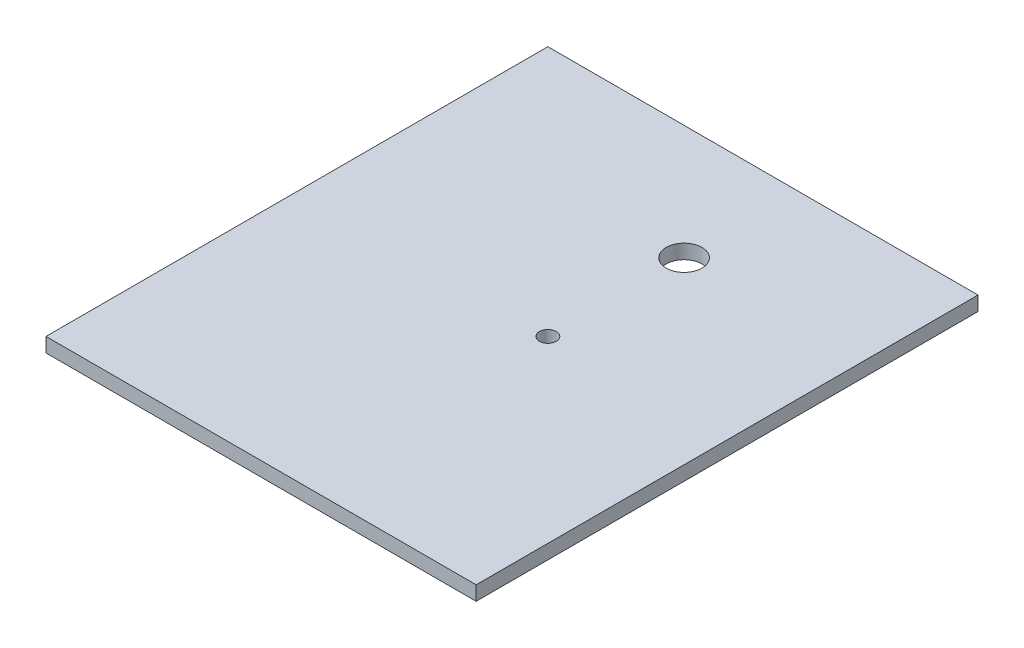
ISO-10303-21;
HEADER;
FILE_DESCRIPTION(('STEP AP214'),'2;1');
FILE_NAME('part.step','',(''),(''),'','','');
FILE_SCHEMA(('AUTOMOTIVE_DESIGN { 1 0 10303 214 1 1 1 1 }'));
ENDSEC;
DATA;
#1=APPLICATION_CONTEXT('core data for automotive mechanical design processes');
#2=APPLICATION_PROTOCOL_DEFINITION('international standard','automotive_design',2000,#1);
#3=PRODUCT_CONTEXT('',#1,'mechanical');
#4=PRODUCT('Part','Part','',(#3));
#5=PRODUCT_RELATED_PRODUCT_CATEGORY('part','',(#4));
#6=PRODUCT_DEFINITION_FORMATION('','',#4);
#7=PRODUCT_DEFINITION_CONTEXT('part definition',#1,'design');
#8=PRODUCT_DEFINITION('design','',#6,#7);
#9=PRODUCT_DEFINITION_SHAPE('','',#8);
#10=(LENGTH_UNIT() NAMED_UNIT(*) SI_UNIT(.MILLI.,.METRE.));
#11=(NAMED_UNIT(*) PLANE_ANGLE_UNIT() SI_UNIT($,.RADIAN.));
#12=(NAMED_UNIT(*) SI_UNIT($,.STERADIAN.) SOLID_ANGLE_UNIT());
#13=UNCERTAINTY_MEASURE_WITH_UNIT(LENGTH_MEASURE(1.E-05),#10,'distance_accuracy_value','');
#14=(GEOMETRIC_REPRESENTATION_CONTEXT(3) GLOBAL_UNCERTAINTY_ASSIGNED_CONTEXT((#13)) GLOBAL_UNIT_ASSIGNED_CONTEXT((#10,
#11,#12)) REPRESENTATION_CONTEXT('',''));
#15=CARTESIAN_POINT('',(0.,0.,0.));
#16=DIRECTION('',(0.,0.,1.));
#17=DIRECTION('',(1.,0.,0.));
#18=AXIS2_PLACEMENT_3D('',#15,#16,#17);
#19=CARTESIAN_POINT('',(0.,5.08,0.));
#20=DIRECTION('',(0.,-1.,0.));
#21=DIRECTION('',(0.,0.,-1.));
#22=AXIS2_PLACEMENT_3D('',#19,#20,#21);
#23=PLANE('',#22);
#24=DIRECTION('',(0.,0.,-1.));
#25=VECTOR('',#24,1.);
#26=CARTESIAN_POINT('',(63.5,5.08,-88.9));
#27=LINE('',#26,#25);
#28=CARTESIAN_POINT('',(63.5,5.08,88.9));
#29=VERTEX_POINT('',#28);
#30=CARTESIAN_POINT('',(63.5,5.08,-88.9));
#31=VERTEX_POINT('',#30);
#32=EDGE_CURVE('E92',#29,#31,#27,.T.);
#33=ORIENTED_EDGE('',*,*,#32,.T.);
#34=DIRECTION('',(-1.,0.,0.));
#35=VECTOR('',#34,1.);
#36=CARTESIAN_POINT('',(63.5,5.08,-88.9));
#37=LINE('',#36,#35);
#38=CARTESIAN_POINT('',(-88.9,5.08,-88.9));
#39=VERTEX_POINT('',#38);
#40=EDGE_CURVE('E87',#31,#39,#37,.T.);
#41=ORIENTED_EDGE('',*,*,#40,.T.);
#42=DIRECTION('',(0.,0.,1.));
#43=VECTOR('',#42,1.);
#44=CARTESIAN_POINT('',(-88.9,5.08,-88.9));
#45=LINE('',#44,#43);
#46=CARTESIAN_POINT('',(-88.9,5.08,88.9));
#47=VERTEX_POINT('',#46);
#48=EDGE_CURVE('E90',#39,#47,#45,.T.);
#49=ORIENTED_EDGE('',*,*,#48,.T.);
#50=DIRECTION('',(1.,0.,0.));
#51=VECTOR('',#50,1.);
#52=CARTESIAN_POINT('',(63.5,5.08,88.9));
#53=LINE('',#52,#51);
#54=EDGE_CURVE('E57',#47,#29,#53,.T.);
#55=ORIENTED_EDGE('',*,*,#54,.T.);
#56=EDGE_LOOP('',(#33,#41,#49,#55));
#57=FACE_BOUND('',#56,.T.);
#58=CARTESIAN_POINT('',(0.,5.08,0.));
#59=DIRECTION('',(0.,1.,0.));
#60=DIRECTION('',(0.,0.,1.));
#61=AXIS2_PLACEMENT_3D('',#58,#59,#60);
#62=CIRCLE('',#61,2.9972);
#63=CARTESIAN_POINT('',(0.,5.08,2.9972));
#64=VERTEX_POINT('',#63);
#65=EDGE_CURVE('E112',#64,#64,#62,.T.);
#66=ORIENTED_EDGE('',*,*,#65,.F.);
#67=EDGE_LOOP('',(#66));
#68=FACE_BOUND('',#67,.T.);
#69=CARTESIAN_POINT('',(0.,5.08,-48.26));
#70=DIRECTION('',(0.,1.,0.));
#71=DIRECTION('',(0.,0.,1.));
#72=AXIS2_PLACEMENT_3D('',#69,#70,#71);
#73=CIRCLE('',#72,6.35);
#74=CARTESIAN_POINT('',(0.,5.08,-41.91));
#75=VERTEX_POINT('',#74);
#76=EDGE_CURVE('E134',#75,#75,#73,.T.);
#77=ORIENTED_EDGE('',*,*,#76,.F.);
#78=EDGE_LOOP('',(#77));
#79=FACE_BOUND('',#78,.T.);
#80=ADVANCED_FACE('F39',(#57,#68,#79),#23,.F.);
#81=CARTESIAN_POINT('',(0.,0.,0.));
#82=DIRECTION('',(0.,-1.,0.));
#83=DIRECTION('',(0.,0.,-1.));
#84=AXIS2_PLACEMENT_3D('',#81,#82,#83);
#85=PLANE('',#84);
#86=CARTESIAN_POINT('',(0.,0.,0.));
#87=DIRECTION('',(0.,1.,0.));
#88=DIRECTION('',(0.,0.,1.));
#89=AXIS2_PLACEMENT_3D('',#86,#87,#88);
#90=CIRCLE('',#89,2.9972);
#91=CARTESIAN_POINT('',(0.,0.,2.9972));
#92=VERTEX_POINT('',#91);
#93=EDGE_CURVE('E130',#92,#92,#90,.T.);
#94=ORIENTED_EDGE('',*,*,#93,.T.);
#95=EDGE_LOOP('',(#94));
#96=FACE_BOUND('',#95,.T.);
#97=DIRECTION('',(0.,0.,-1.));
#98=VECTOR('',#97,1.);
#99=CARTESIAN_POINT('',(63.5,0.,-88.9));
#100=LINE('',#99,#98);
#101=CARTESIAN_POINT('',(63.5,0.,88.9));
#102=VERTEX_POINT('',#101);
#103=CARTESIAN_POINT('',(63.5,0.,-88.9));
#104=VERTEX_POINT('',#103);
#105=EDGE_CURVE('E108',#102,#104,#100,.T.);
#106=ORIENTED_EDGE('',*,*,#105,.F.);
#107=DIRECTION('',(1.,0.,0.));
#108=VECTOR('',#107,1.);
#109=CARTESIAN_POINT('',(63.5,0.,88.9));
#110=LINE('',#109,#108);
#111=CARTESIAN_POINT('',(-88.9,0.,88.9));
#112=VERTEX_POINT('',#111);
#113=EDGE_CURVE('E80',#112,#102,#110,.T.);
#114=ORIENTED_EDGE('',*,*,#113,.F.);
#115=DIRECTION('',(0.,0.,1.));
#116=VECTOR('',#115,1.);
#117=CARTESIAN_POINT('',(-88.9,0.,-88.9));
#118=LINE('',#117,#116);
#119=CARTESIAN_POINT('',(-88.9,0.,-88.9));
#120=VERTEX_POINT('',#119);
#121=EDGE_CURVE('E74',#120,#112,#118,.T.);
#122=ORIENTED_EDGE('',*,*,#121,.F.);
#123=DIRECTION('',(-1.,0.,0.));
#124=VECTOR('',#123,1.);
#125=CARTESIAN_POINT('',(63.5,0.,-88.9));
#126=LINE('',#125,#124);
#127=EDGE_CURVE('E97',#104,#120,#126,.T.);
#128=ORIENTED_EDGE('',*,*,#127,.F.);
#129=EDGE_LOOP('',(#106,#114,#122,#128));
#130=FACE_BOUND('',#129,.T.);
#131=CARTESIAN_POINT('',(0.,0.,-48.26));
#132=DIRECTION('',(0.,1.,0.));
#133=DIRECTION('',(0.,0.,1.));
#134=AXIS2_PLACEMENT_3D('',#131,#132,#133);
#135=CIRCLE('',#134,6.35);
#136=CARTESIAN_POINT('',(0.,0.,-41.91));
#137=VERTEX_POINT('',#136);
#138=EDGE_CURVE('E138',#137,#137,#135,.T.);
#139=ORIENTED_EDGE('',*,*,#138,.T.);
#140=EDGE_LOOP('',(#139));
#141=FACE_BOUND('',#140,.T.);
#142=ADVANCED_FACE('F125',(#96,#130,#141),#85,.T.);
#143=CARTESIAN_POINT('',(63.5,5.08,-88.9));
#144=DIRECTION('',(-1.,0.,0.));
#145=DIRECTION('',(0.,0.,1.));
#146=AXIS2_PLACEMENT_3D('',#143,#144,#145);
#147=PLANE('',#146);
#148=ORIENTED_EDGE('',*,*,#105,.T.);
#149=DIRECTION('',(0.,-1.,0.));
#150=VECTOR('',#149,1.);
#151=CARTESIAN_POINT('',(63.5,5.08,-88.9));
#152=LINE('',#151,#150);
#153=EDGE_CURVE('E11',#31,#104,#152,.T.);
#154=ORIENTED_EDGE('',*,*,#153,.F.);
#155=ORIENTED_EDGE('',*,*,#32,.F.);
#156=DIRECTION('',(0.,-1.,0.));
#157=VECTOR('',#156,1.);
#158=CARTESIAN_POINT('',(63.5,5.08,88.9));
#159=LINE('',#158,#157);
#160=EDGE_CURVE('E104',#29,#102,#159,.T.);
#161=ORIENTED_EDGE('',*,*,#160,.T.);
#162=EDGE_LOOP('',(#148,#154,#155,#161));
#163=FACE_BOUND('',#162,.T.);
#164=ADVANCED_FACE('F41',(#163),#147,.F.);
#165=CARTESIAN_POINT('',(63.5,5.08,-88.9));
#166=DIRECTION('',(0.,0.,1.));
#167=DIRECTION('',(1.,0.,0.));
#168=AXIS2_PLACEMENT_3D('',#165,#166,#167);
#169=PLANE('',#168);
#170=ORIENTED_EDGE('',*,*,#127,.T.);
#171=DIRECTION('',(0.,-1.,0.));
#172=VECTOR('',#171,1.);
#173=CARTESIAN_POINT('',(-88.9,5.08,-88.9));
#174=LINE('',#173,#172);
#175=EDGE_CURVE('E49',#39,#120,#174,.T.);
#176=ORIENTED_EDGE('',*,*,#175,.F.);
#177=ORIENTED_EDGE('',*,*,#40,.F.);
#178=ORIENTED_EDGE('',*,*,#153,.T.);
#179=EDGE_LOOP('',(#170,#176,#177,#178));
#180=FACE_BOUND('',#179,.T.);
#181=ADVANCED_FACE('F96',(#180),#169,.F.);
#182=CARTESIAN_POINT('',(-88.9,5.08,-88.9));
#183=DIRECTION('',(1.,0.,0.));
#184=DIRECTION('',(0.,0.,-1.));
#185=AXIS2_PLACEMENT_3D('',#182,#183,#184);
#186=PLANE('',#185);
#187=ORIENTED_EDGE('',*,*,#121,.T.);
#188=DIRECTION('',(0.,-1.,0.));
#189=VECTOR('',#188,1.);
#190=CARTESIAN_POINT('',(-88.9,5.08,88.9));
#191=LINE('',#190,#189);
#192=EDGE_CURVE('E99',#47,#112,#191,.T.);
#193=ORIENTED_EDGE('',*,*,#192,.F.);
#194=ORIENTED_EDGE('',*,*,#48,.F.);
#195=ORIENTED_EDGE('',*,*,#175,.T.);
#196=EDGE_LOOP('',(#187,#193,#194,#195));
#197=FACE_BOUND('',#196,.T.);
#198=ADVANCED_FACE('F100',(#197),#186,.F.);
#199=CARTESIAN_POINT('',(63.5,5.08,88.9));
#200=DIRECTION('',(0.,0.,-1.));
#201=DIRECTION('',(-1.,0.,0.));
#202=AXIS2_PLACEMENT_3D('',#199,#200,#201);
#203=PLANE('',#202);
#204=ORIENTED_EDGE('',*,*,#113,.T.);
#205=ORIENTED_EDGE('',*,*,#160,.F.);
#206=ORIENTED_EDGE('',*,*,#54,.F.);
#207=ORIENTED_EDGE('',*,*,#192,.T.);
#208=EDGE_LOOP('',(#204,#205,#206,#207));
#209=FACE_BOUND('',#208,.T.);
#210=ADVANCED_FACE('F122',(#209),#203,.F.);
#211=CARTESIAN_POINT('',(0.,5.08,0.));
#212=DIRECTION('',(0.,-1.,0.));
#213=DIRECTION('',(0.,0.,-1.));
#214=AXIS2_PLACEMENT_3D('',#211,#212,#213);
#215=CYLINDRICAL_SURFACE('',#214,2.9972);
#216=ORIENTED_EDGE('',*,*,#65,.T.);
#217=EDGE_LOOP('',(#216));
#218=FACE_BOUND('',#217,.T.);
#219=ORIENTED_EDGE('',*,*,#93,.F.);
#220=EDGE_LOOP('',(#219));
#221=FACE_BOUND('',#220,.T.);
#222=ADVANCED_FACE('F157',(#218,#221),#215,.F.);
#223=CARTESIAN_POINT('',(0.,5.08,-48.26));
#224=DIRECTION('',(0.,-1.,0.));
#225=DIRECTION('',(0.,0.,-1.));
#226=AXIS2_PLACEMENT_3D('',#223,#224,#225);
#227=CYLINDRICAL_SURFACE('',#226,6.35);
#228=ORIENTED_EDGE('',*,*,#76,.T.);
#229=EDGE_LOOP('',(#228));
#230=FACE_BOUND('',#229,.T.);
#231=ORIENTED_EDGE('',*,*,#138,.F.);
#232=EDGE_LOOP('',(#231));
#233=FACE_BOUND('',#232,.T.);
#234=ADVANCED_FACE('F146',(#230,#233),#227,.F.);
#235=CLOSED_SHELL('',(#80,#142,#164,#181,#198,#210,#222,#234));
#236=MANIFOLD_SOLID_BREP('B2',#235);
#237=ADVANCED_BREP_SHAPE_REPRESENTATION('',(#18,#236),#14);
#238=SHAPE_DEFINITION_REPRESENTATION(#9,#237);
ENDSEC;
END-ISO-10303-21;
